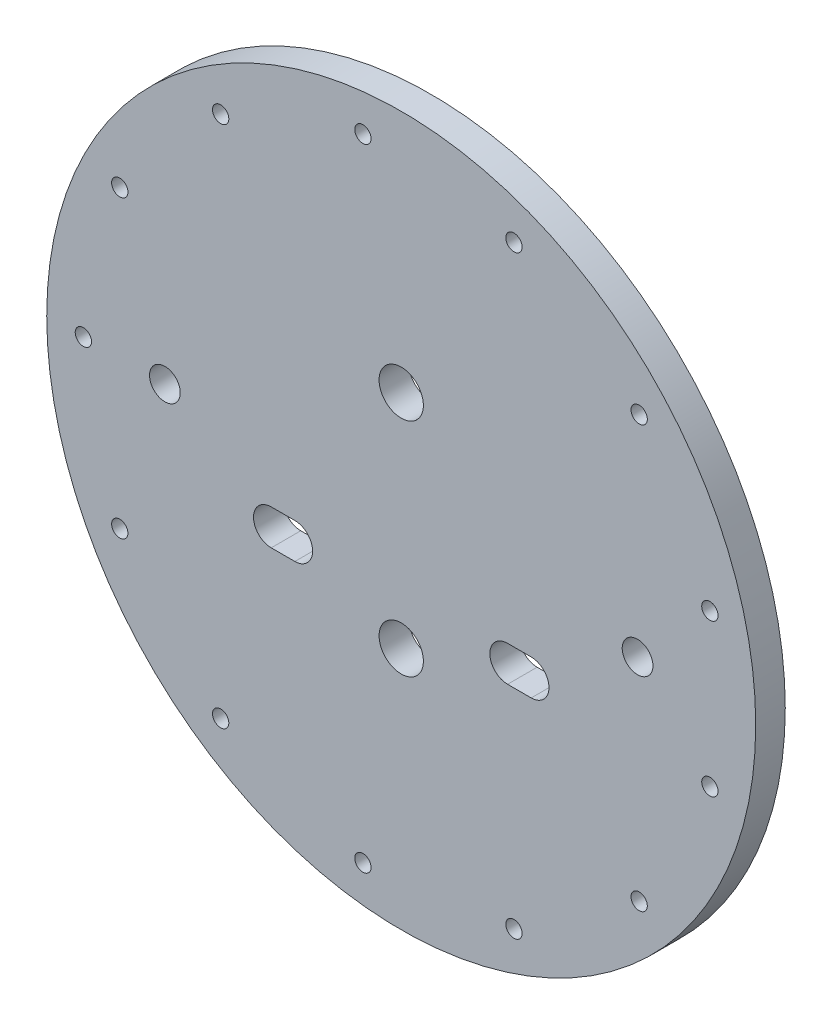
ISO-10303-21;
HEADER;
FILE_DESCRIPTION(('STEP AP214'),'2;1');
FILE_NAME('part.step','',(''),(''),'','','');
FILE_SCHEMA(('AUTOMOTIVE_DESIGN { 1 0 10303 214 1 1 1 1 }'));
ENDSEC;
DATA;
#1=APPLICATION_CONTEXT('core data for automotive mechanical design processes');
#2=APPLICATION_PROTOCOL_DEFINITION('international standard','automotive_design',2000,#1);
#3=PRODUCT_CONTEXT('',#1,'mechanical');
#4=PRODUCT('Part','Part','',(#3));
#5=PRODUCT_RELATED_PRODUCT_CATEGORY('part','',(#4));
#6=PRODUCT_DEFINITION_FORMATION('','',#4);
#7=PRODUCT_DEFINITION_CONTEXT('part definition',#1,'design');
#8=PRODUCT_DEFINITION('design','',#6,#7);
#9=PRODUCT_DEFINITION_SHAPE('','',#8);
#10=(LENGTH_UNIT() NAMED_UNIT(*) SI_UNIT(.MILLI.,.METRE.));
#11=(NAMED_UNIT(*) PLANE_ANGLE_UNIT() SI_UNIT($,.RADIAN.));
#12=(NAMED_UNIT(*) SI_UNIT($,.STERADIAN.) SOLID_ANGLE_UNIT());
#13=UNCERTAINTY_MEASURE_WITH_UNIT(LENGTH_MEASURE(1.E-05),#10,'distance_accuracy_value','');
#14=(GEOMETRIC_REPRESENTATION_CONTEXT(3) GLOBAL_UNCERTAINTY_ASSIGNED_CONTEXT((#13)) GLOBAL_UNIT_ASSIGNED_CONTEXT((#10,
#11,#12)) REPRESENTATION_CONTEXT('',''));
#15=CARTESIAN_POINT('',(0.,0.,0.));
#16=DIRECTION('',(0.,0.,1.));
#17=DIRECTION('',(1.,0.,0.));
#18=AXIS2_PLACEMENT_3D('',#15,#16,#17);
#19=CARTESIAN_POINT('',(0.,0.,3.175));
#20=DIRECTION('',(0.,0.,1.));
#21=DIRECTION('',(1.,0.,0.));
#22=AXIS2_PLACEMENT_3D('',#19,#20,#21);
#23=PLANE('',#22);
#24=CARTESIAN_POINT('',(-38.8135918851528,-56.23119562105,3.175));
#25=DIRECTION('',(0.,0.,1.));
#26=DIRECTION('',(0.568064746731154,0.822983865893658,0.));
#27=AXIS2_PLACEMENT_3D('',#24,#25,#26);
#28=CIRCLE('',#27,1.75259999999999);
#29=CARTESIAN_POINT('',(-37.8180016100318,-54.7888340976848,3.175));
#30=VERTEX_POINT('',#29);
#31=EDGE_CURVE('E546',#30,#30,#28,.T.);
#32=ORIENTED_EDGE('',*,*,#31,.F.);
#33=EDGE_LOOP('',(#32));
#34=FACE_BOUND('',#33,.T.);
#35=CARTESIAN_POINT('',(-8.23578921512499,-67.8278265316237,3.175));
#36=DIRECTION('',(0.,0.,1.));
#37=DIRECTION('',(0.12053668025532,0.992708874098054,0.));
#38=AXIS2_PLACEMENT_3D('',#35,#36,#37);
#39=CIRCLE('',#38,1.75259999999999);
#40=CARTESIAN_POINT('',(-8.02453662930952,-66.0880049588794,3.175));
#41=VERTEX_POINT('',#40);
#42=EDGE_CURVE('E547',#41,#41,#39,.T.);
#43=ORIENTED_EDGE('',*,*,#42,.F.);
#44=EDGE_LOOP('',(#43));
#45=FACE_BOUND('',#44,.T.);
#46=CARTESIAN_POINT('',(24.2287335120686,-63.8859197977235,3.175));
#47=DIRECTION('',(0.,0.,1.));
#48=DIRECTION('',(-0.35460488704254,0.935016242685413,0.));
#49=AXIS2_PLACEMENT_3D('',#46,#47,#48);
#50=CIRCLE('',#49,1.75259999999999);
#51=CARTESIAN_POINT('',(23.6072529870378,-62.2472103307931,3.175));
#52=VERTEX_POINT('',#51);
#53=EDGE_CURVE('E551',#52,#52,#50,.T.);
#54=ORIENTED_EDGE('',*,*,#53,.F.);
#55=EDGE_LOOP('',(#54));
#56=FACE_BOUND('',#55,.T.);
#57=CARTESIAN_POINT('',(51.1427453795389,-45.3085187469603,3.175));
#58=DIRECTION('',(0.,0.,1.));
#59=DIRECTION('',(-0.748510748171105,0.663122658240791,0.));
#60=AXIS2_PLACEMENT_3D('',#57,#58,#59);
#61=CIRCLE('',#60,1.75259999999999);
#62=CARTESIAN_POINT('',(49.8309054422942,-44.1463299761275,3.175));
#63=VERTEX_POINT('',#62);
#64=EDGE_CURVE('E559',#63,#63,#61,.T.);
#65=ORIENTED_EDGE('',*,*,#64,.F.);
#66=EDGE_LOOP('',(#65));
#67=FACE_BOUND('',#66,.T.);
#68=CARTESIAN_POINT('',(66.3405706174525,-16.3514820781112,3.175));
#69=DIRECTION('',(0.,0.,1.));
#70=DIRECTION('',(-0.970941817426054,0.239315664287552,0.));
#71=AXIS2_PLACEMENT_3D('',#68,#69,#70);
#72=CIRCLE('',#71,1.75259999999999);
#73=CARTESIAN_POINT('',(64.6388979882316,-15.9320574448809,3.175));
#74=VERTEX_POINT('',#73);
#75=EDGE_CURVE('E562',#74,#74,#72,.T.);
#76=ORIENTED_EDGE('',*,*,#75,.F.);
#77=EDGE_LOOP('',(#76));
#78=FACE_BOUND('',#77,.T.);
#79=CARTESIAN_POINT('',(66.3405706174523,16.3514820781122,3.175));
#80=DIRECTION('',(0.,0.,1.));
#81=DIRECTION('',(-0.97094181742605,-0.239315664287565,0.));
#82=AXIS2_PLACEMENT_3D('',#79,#80,#81);
#83=CIRCLE('',#82,1.75259999999999);
#84=CARTESIAN_POINT('',(64.6388979882314,15.9320574448818,3.175));
#85=VERTEX_POINT('',#84);
#86=EDGE_CURVE('E565',#85,#85,#83,.T.);
#87=ORIENTED_EDGE('',*,*,#86,.F.);
#88=EDGE_LOOP('',(#87));
#89=FACE_BOUND('',#88,.T.);
#90=CARTESIAN_POINT('',(51.1427453795383,45.308518746961,3.175));
#91=DIRECTION('',(0.,0.,1.));
#92=DIRECTION('',(-0.748510748171095,-0.663122658240802,0.));
#93=AXIS2_PLACEMENT_3D('',#90,#91,#92);
#94=CIRCLE('',#93,1.75259999999999);
#95=CARTESIAN_POINT('',(49.8309054422936,44.1463299761282,3.175));
#96=VERTEX_POINT('',#95);
#97=EDGE_CURVE('E568',#96,#96,#94,.T.);
#98=ORIENTED_EDGE('',*,*,#97,.F.);
#99=EDGE_LOOP('',(#98));
#100=FACE_BOUND('',#99,.T.);
#101=CARTESIAN_POINT('',(24.2287335120677,63.8859197977239,3.175));
#102=DIRECTION('',(0.,0.,1.));
#103=DIRECTION('',(-0.354604887042527,-0.935016242685418,0.));
#104=AXIS2_PLACEMENT_3D('',#101,#102,#103);
#105=CIRCLE('',#104,1.75259999999999);
#106=CARTESIAN_POINT('',(23.607252987037,62.2472103307934,3.175));
#107=VERTEX_POINT('',#106);
#108=EDGE_CURVE('E571',#107,#107,#105,.T.);
#109=ORIENTED_EDGE('',*,*,#108,.F.);
#110=EDGE_LOOP('',(#109));
#111=FACE_BOUND('',#110,.T.);
#112=CARTESIAN_POINT('',(-8.23578921512594,67.8278265316236,3.175));
#113=DIRECTION('',(0.,0.,1.));
#114=DIRECTION('',(0.120536680255334,-0.992708874098053,0.));
#115=AXIS2_PLACEMENT_3D('',#112,#113,#114);
#116=CIRCLE('',#115,1.75259999999999);
#117=CARTESIAN_POINT('',(-8.02453662931044,66.0880049588793,3.175));
#118=VERTEX_POINT('',#117);
#119=EDGE_CURVE('E573',#118,#118,#116,.T.);
#120=ORIENTED_EDGE('',*,*,#119,.F.);
#121=EDGE_LOOP('',(#120));
#122=FACE_BOUND('',#121,.T.);
#123=CARTESIAN_POINT('',(-38.8135918851536,56.2311956210495,3.175));
#124=DIRECTION('',(0.,0.,1.));
#125=DIRECTION('',(0.568064746731166,-0.822983865893649,0.));
#126=AXIS2_PLACEMENT_3D('',#123,#124,#125);
#127=CIRCLE('',#126,1.75259999999999);
#128=CARTESIAN_POINT('',(-37.8180016100326,54.7888340976843,3.175));
#129=VERTEX_POINT('',#128);
#130=EDGE_CURVE('E576',#129,#129,#127,.T.);
#131=ORIENTED_EDGE('',*,*,#130,.F.);
#132=EDGE_LOOP('',(#131));
#133=FACE_BOUND('',#132,.T.);
#134=CARTESIAN_POINT('',(-60.4996684087816,31.7526754530618,3.175));
#135=DIRECTION('',(0.,0.,1.));
#136=DIRECTION('',(0.885456025653216,-0.464723172043757,0.));
#137=AXIS2_PLACEMENT_3D('',#134,#135,#136);
#138=CIRCLE('',#137,1.75259999999999);
#139=CARTESIAN_POINT('',(-58.9478181782218,30.9382016217379,3.175));
#140=VERTEX_POINT('',#139);
#141=EDGE_CURVE('E554',#140,#140,#138,.T.);
#142=ORIENTED_EDGE('',*,*,#141,.F.);
#143=EDGE_LOOP('',(#142));
#144=FACE_BOUND('',#143,.T.);
#145=CARTESIAN_POINT('',(-60.4996684087812,-31.7526754530626,3.175));
#146=DIRECTION('',(0.,0.,1.));
#147=DIRECTION('',(0.885456025653209,0.46472317204377,0.));
#148=AXIS2_PLACEMENT_3D('',#145,#146,#147);
#149=CIRCLE('',#148,1.75259999999999);
#150=CARTESIAN_POINT('',(-58.9478181782214,-30.9382016217387,3.175));
#151=VERTEX_POINT('',#150);
#152=EDGE_CURVE('E203',#151,#151,#149,.T.);
#153=ORIENTED_EDGE('',*,*,#152,.F.);
#154=EDGE_LOOP('',(#153));
#155=FACE_BOUND('',#154,.T.);
#156=CARTESIAN_POINT('',(-68.326,0.,3.175));
#157=DIRECTION('',(0.,0.,1.));
#158=DIRECTION('',(1.,0.,0.));
#159=AXIS2_PLACEMENT_3D('',#156,#157,#158);
#160=CIRCLE('',#159,1.75259999999999);
#161=CARTESIAN_POINT('',(-66.5734,0.,3.175));
#162=VERTEX_POINT('',#161);
#163=EDGE_CURVE('E123',#162,#162,#160,.T.);
#164=ORIENTED_EDGE('',*,*,#163,.F.);
#165=EDGE_LOOP('',(#164));
#166=FACE_BOUND('',#165,.T.);
#167=CARTESIAN_POINT('',(27.94,-15.24,3.175));
#168=DIRECTION('',(0.,0.,-1.));
#169=DIRECTION('',(-1.,0.,0.));
#170=AXIS2_PLACEMENT_3D('',#167,#168,#169);
#171=CIRCLE('',#170,3.81);
#172=CARTESIAN_POINT('',(27.94,-11.43,3.175));
#173=VERTEX_POINT('',#172);
#174=CARTESIAN_POINT('',(27.94,-19.05,3.175));
#175=VERTEX_POINT('',#174);
#176=EDGE_CURVE('E140',#173,#175,#171,.T.);
#177=ORIENTED_EDGE('',*,*,#176,.T.);
#178=DIRECTION('',(-1.,0.,0.));
#179=VECTOR('',#178,1.);
#180=CARTESIAN_POINT('',(27.94,-19.05,3.175));
#181=LINE('',#180,#179);
#182=CARTESIAN_POINT('',(22.86,-19.05,3.175));
#183=VERTEX_POINT('',#182);
#184=EDGE_CURVE('E143',#175,#183,#181,.T.);
#185=ORIENTED_EDGE('',*,*,#184,.T.);
#186=CARTESIAN_POINT('',(22.86,-15.24,3.175));
#187=DIRECTION('',(0.,0.,-1.));
#188=DIRECTION('',(-1.,0.,0.));
#189=AXIS2_PLACEMENT_3D('',#186,#187,#188);
#190=CIRCLE('',#189,3.81);
#191=CARTESIAN_POINT('',(22.86,-11.43,3.175));
#192=VERTEX_POINT('',#191);
#193=EDGE_CURVE('E147',#183,#192,#190,.T.);
#194=ORIENTED_EDGE('',*,*,#193,.T.);
#195=DIRECTION('',(1.,0.,0.));
#196=VECTOR('',#195,1.);
#197=CARTESIAN_POINT('',(27.94,-11.43,3.175));
#198=LINE('',#197,#196);
#199=EDGE_CURVE('E150',#192,#173,#198,.T.);
#200=ORIENTED_EDGE('',*,*,#199,.T.);
#201=EDGE_LOOP('',(#177,#185,#194,#200));
#202=FACE_BOUND('',#201,.T.);
#203=CARTESIAN_POINT('',(0.,23.8125,3.175));
#204=DIRECTION('',(0.,0.,1.));
#205=DIRECTION('',(1.,0.,0.));
#206=AXIS2_PLACEMENT_3D('',#203,#204,#205);
#207=CIRCLE('',#206,4.76250000000001);
#208=CARTESIAN_POINT('',(4.76250000000001,23.8125,3.175));
#209=VERTEX_POINT('',#208);
#210=EDGE_CURVE('E178',#209,#209,#207,.T.);
#211=ORIENTED_EDGE('',*,*,#210,.F.);
#212=EDGE_LOOP('',(#211));
#213=FACE_BOUND('',#212,.T.);
#214=CARTESIAN_POINT('',(-50.8,0.,3.175));
#215=DIRECTION('',(0.,0.,1.));
#216=DIRECTION('',(1.,0.,0.));
#217=AXIS2_PLACEMENT_3D('',#214,#215,#216);
#218=CIRCLE('',#217,3.302);
#219=CARTESIAN_POINT('',(-47.498,0.,3.175));
#220=VERTEX_POINT('',#219);
#221=EDGE_CURVE('E190',#220,#220,#218,.T.);
#222=ORIENTED_EDGE('',*,*,#221,.F.);
#223=EDGE_LOOP('',(#222));
#224=FACE_BOUND('',#223,.T.);
#225=CARTESIAN_POINT('',(0.,0.,3.175));
#226=DIRECTION('',(0.,0.,1.));
#227=DIRECTION('',(1.,0.,0.));
#228=AXIS2_PLACEMENT_3D('',#225,#226,#227);
#229=CIRCLE('',#228,76.2);
#230=CARTESIAN_POINT('',(76.2,0.,3.175));
#231=VERTEX_POINT('',#230);
#232=EDGE_CURVE('E11',#231,#231,#229,.T.);
#233=ORIENTED_EDGE('',*,*,#232,.T.);
#234=EDGE_LOOP('',(#233));
#235=FACE_BOUND('',#234,.T.);
#236=CARTESIAN_POINT('',(50.8,0.,3.175));
#237=DIRECTION('',(0.,0.,1.));
#238=DIRECTION('',(1.,0.,0.));
#239=AXIS2_PLACEMENT_3D('',#236,#237,#238);
#240=CIRCLE('',#239,3.302);
#241=CARTESIAN_POINT('',(54.102,0.,3.175));
#242=VERTEX_POINT('',#241);
#243=EDGE_CURVE('E184',#242,#242,#240,.T.);
#244=ORIENTED_EDGE('',*,*,#243,.F.);
#245=EDGE_LOOP('',(#244));
#246=FACE_BOUND('',#245,.T.);
#247=CARTESIAN_POINT('',(0.,-23.8125,3.175));
#248=DIRECTION('',(0.,0.,1.));
#249=DIRECTION('',(1.,0.,0.));
#250=AXIS2_PLACEMENT_3D('',#247,#248,#249);
#251=CIRCLE('',#250,4.76250000000001);
#252=CARTESIAN_POINT('',(4.76250000000002,-23.8125,3.175));
#253=VERTEX_POINT('',#252);
#254=EDGE_CURVE('E172',#253,#253,#251,.T.);
#255=ORIENTED_EDGE('',*,*,#254,.F.);
#256=EDGE_LOOP('',(#255));
#257=FACE_BOUND('',#256,.T.);
#258=DIRECTION('',(1.,0.,0.));
#259=VECTOR('',#258,1.);
#260=CARTESIAN_POINT('',(-27.94,-19.05,3.175));
#261=LINE('',#260,#259);
#262=CARTESIAN_POINT('',(-27.94,-19.05,3.175));
#263=VERTEX_POINT('',#262);
#264=CARTESIAN_POINT('',(-22.86,-19.05,3.175));
#265=VERTEX_POINT('',#264);
#266=EDGE_CURVE('E114',#263,#265,#261,.T.);
#267=ORIENTED_EDGE('',*,*,#266,.F.);
#268=CARTESIAN_POINT('',(-27.94,-15.24,3.175));
#269=DIRECTION('',(0.,0.,1.));
#270=DIRECTION('',(1.,0.,0.));
#271=AXIS2_PLACEMENT_3D('',#268,#269,#270);
#272=CIRCLE('',#271,3.81);
#273=CARTESIAN_POINT('',(-27.94,-11.43,3.175));
#274=VERTEX_POINT('',#273);
#275=EDGE_CURVE('E110',#274,#263,#272,.T.);
#276=ORIENTED_EDGE('',*,*,#275,.F.);
#277=DIRECTION('',(-1.,0.,0.));
#278=VECTOR('',#277,1.);
#279=CARTESIAN_POINT('',(-27.94,-11.43,3.175));
#280=LINE('',#279,#278);
#281=CARTESIAN_POINT('',(-22.86,-11.43,3.175));
#282=VERTEX_POINT('',#281);
#283=EDGE_CURVE('E102',#282,#274,#280,.T.);
#284=ORIENTED_EDGE('',*,*,#283,.F.);
#285=CARTESIAN_POINT('',(-22.86,-15.24,3.175));
#286=DIRECTION('',(0.,0.,1.));
#287=DIRECTION('',(1.,0.,0.));
#288=AXIS2_PLACEMENT_3D('',#285,#286,#287);
#289=CIRCLE('',#288,3.81);
#290=EDGE_CURVE('E109',#265,#282,#289,.T.);
#291=ORIENTED_EDGE('',*,*,#290,.F.);
#292=EDGE_LOOP('',(#267,#276,#284,#291));
#293=FACE_BOUND('',#292,.T.);
#294=ADVANCED_FACE('F35',(#34,#45,#56,#67,#78,#89,#100,#111,#122,#133,#144,#155,#166,#202,#213,
#224,#235,#246,#257,#293),#23,.T.);
#295=CARTESIAN_POINT('',(0.,0.,-3.175));
#296=DIRECTION('',(0.,0.,1.));
#297=DIRECTION('',(1.,0.,0.));
#298=AXIS2_PLACEMENT_3D('',#295,#296,#297);
#299=PLANE('',#298);
#300=CARTESIAN_POINT('',(-38.8135918851528,-56.23119562105,-3.175));
#301=DIRECTION('',(0.,0.,1.));
#302=DIRECTION('',(1.,0.,0.));
#303=AXIS2_PLACEMENT_3D('',#300,#301,#302);
#304=CIRCLE('',#303,1.75259999999999);
#305=CARTESIAN_POINT('',(-37.0609918851528,-56.23119562105,-3.175));
#306=VERTEX_POINT('',#305);
#307=EDGE_CURVE('E39',#306,#306,#304,.T.);
#308=ORIENTED_EDGE('',*,*,#307,.T.);
#309=EDGE_LOOP('',(#308));
#310=FACE_BOUND('',#309,.T.);
#311=CARTESIAN_POINT('',(-8.23578921512499,-67.8278265316237,-3.175));
#312=DIRECTION('',(0.,0.,1.));
#313=DIRECTION('',(1.,0.,0.));
#314=AXIS2_PLACEMENT_3D('',#311,#312,#313);
#315=CIRCLE('',#314,1.75259999999999);
#316=CARTESIAN_POINT('',(-6.483189215125,-67.8278265316237,-3.175));
#317=VERTEX_POINT('',#316);
#318=EDGE_CURVE('E229',#317,#317,#315,.T.);
#319=ORIENTED_EDGE('',*,*,#318,.T.);
#320=EDGE_LOOP('',(#319));
#321=FACE_BOUND('',#320,.T.);
#322=CARTESIAN_POINT('',(24.2287335120686,-63.8859197977235,-3.175));
#323=DIRECTION('',(0.,0.,1.));
#324=DIRECTION('',(1.,0.,0.));
#325=AXIS2_PLACEMENT_3D('',#322,#323,#324);
#326=CIRCLE('',#325,1.75259999999999);
#327=CARTESIAN_POINT('',(25.9813335120685,-63.8859197977235,-3.175));
#328=VERTEX_POINT('',#327);
#329=EDGE_CURVE('E227',#328,#328,#326,.T.);
#330=ORIENTED_EDGE('',*,*,#329,.T.);
#331=EDGE_LOOP('',(#330));
#332=FACE_BOUND('',#331,.T.);
#333=CARTESIAN_POINT('',(51.1427453795389,-45.3085187469603,-3.175));
#334=DIRECTION('',(0.,0.,1.));
#335=DIRECTION('',(1.,0.,0.));
#336=AXIS2_PLACEMENT_3D('',#333,#334,#335);
#337=CIRCLE('',#336,1.75259999999999);
#338=CARTESIAN_POINT('',(52.8953453795389,-45.3085187469603,-3.175));
#339=VERTEX_POINT('',#338);
#340=EDGE_CURVE('E224',#339,#339,#337,.T.);
#341=ORIENTED_EDGE('',*,*,#340,.T.);
#342=EDGE_LOOP('',(#341));
#343=FACE_BOUND('',#342,.T.);
#344=CARTESIAN_POINT('',(66.3405706174525,-16.3514820781112,-3.175));
#345=DIRECTION('',(0.,0.,1.));
#346=DIRECTION('',(1.,0.,0.));
#347=AXIS2_PLACEMENT_3D('',#344,#345,#346);
#348=CIRCLE('',#347,1.75259999999999);
#349=CARTESIAN_POINT('',(68.0931706174525,-16.3514820781112,-3.175));
#350=VERTEX_POINT('',#349);
#351=EDGE_CURVE('E221',#350,#350,#348,.T.);
#352=ORIENTED_EDGE('',*,*,#351,.T.);
#353=EDGE_LOOP('',(#352));
#354=FACE_BOUND('',#353,.T.);
#355=CARTESIAN_POINT('',(66.3405706174523,16.3514820781122,-3.175));
#356=DIRECTION('',(0.,0.,1.));
#357=DIRECTION('',(1.,0.,0.));
#358=AXIS2_PLACEMENT_3D('',#355,#356,#357);
#359=CIRCLE('',#358,1.75259999999999);
#360=CARTESIAN_POINT('',(68.0931706174523,16.3514820781122,-3.175));
#361=VERTEX_POINT('',#360);
#362=EDGE_CURVE('E218',#361,#361,#359,.T.);
#363=ORIENTED_EDGE('',*,*,#362,.T.);
#364=EDGE_LOOP('',(#363));
#365=FACE_BOUND('',#364,.T.);
#366=CARTESIAN_POINT('',(51.1427453795383,45.308518746961,-3.175));
#367=DIRECTION('',(0.,0.,1.));
#368=DIRECTION('',(1.,0.,0.));
#369=AXIS2_PLACEMENT_3D('',#366,#367,#368);
#370=CIRCLE('',#369,1.75259999999999);
#371=CARTESIAN_POINT('',(52.8953453795383,45.308518746961,-3.175));
#372=VERTEX_POINT('',#371);
#373=EDGE_CURVE('E215',#372,#372,#370,.T.);
#374=ORIENTED_EDGE('',*,*,#373,.T.);
#375=EDGE_LOOP('',(#374));
#376=FACE_BOUND('',#375,.T.);
#377=CARTESIAN_POINT('',(24.2287335120677,63.8859197977239,-3.175));
#378=DIRECTION('',(0.,0.,1.));
#379=DIRECTION('',(1.,0.,0.));
#380=AXIS2_PLACEMENT_3D('',#377,#378,#379);
#381=CIRCLE('',#380,1.75259999999999);
#382=CARTESIAN_POINT('',(25.9813335120677,63.8859197977239,-3.175));
#383=VERTEX_POINT('',#382);
#384=EDGE_CURVE('E212',#383,#383,#381,.T.);
#385=ORIENTED_EDGE('',*,*,#384,.T.);
#386=EDGE_LOOP('',(#385));
#387=FACE_BOUND('',#386,.T.);
#388=CARTESIAN_POINT('',(-8.23578921512594,67.8278265316236,-3.175));
#389=DIRECTION('',(0.,0.,1.));
#390=DIRECTION('',(1.,0.,0.));
#391=AXIS2_PLACEMENT_3D('',#388,#389,#390);
#392=CIRCLE('',#391,1.75259999999999);
#393=CARTESIAN_POINT('',(-6.48318921512595,67.8278265316236,-3.175));
#394=VERTEX_POINT('',#393);
#395=EDGE_CURVE('E209',#394,#394,#392,.T.);
#396=ORIENTED_EDGE('',*,*,#395,.T.);
#397=EDGE_LOOP('',(#396));
#398=FACE_BOUND('',#397,.T.);
#399=CARTESIAN_POINT('',(-38.8135918851536,56.2311956210495,-3.175));
#400=DIRECTION('',(0.,0.,1.));
#401=DIRECTION('',(1.,0.,0.));
#402=AXIS2_PLACEMENT_3D('',#399,#400,#401);
#403=CIRCLE('',#402,1.75259999999999);
#404=CARTESIAN_POINT('',(-37.0609918851536,56.2311956210495,-3.175));
#405=VERTEX_POINT('',#404);
#406=EDGE_CURVE('E206',#405,#405,#403,.T.);
#407=ORIENTED_EDGE('',*,*,#406,.T.);
#408=EDGE_LOOP('',(#407));
#409=FACE_BOUND('',#408,.T.);
#410=CARTESIAN_POINT('',(-60.4996684087816,31.7526754530618,-3.175));
#411=DIRECTION('',(0.,0.,1.));
#412=DIRECTION('',(1.,0.,0.));
#413=AXIS2_PLACEMENT_3D('',#410,#411,#412);
#414=CIRCLE('',#413,1.75259999999999);
#415=CARTESIAN_POINT('',(-58.7470684087816,31.7526754530618,-3.175));
#416=VERTEX_POINT('',#415);
#417=EDGE_CURVE('E202',#416,#416,#414,.T.);
#418=ORIENTED_EDGE('',*,*,#417,.T.);
#419=EDGE_LOOP('',(#418));
#420=FACE_BOUND('',#419,.T.);
#421=CARTESIAN_POINT('',(-60.4996684087812,-31.7526754530626,-3.175));
#422=DIRECTION('',(0.,0.,1.));
#423=DIRECTION('',(1.,0.,0.));
#424=AXIS2_PLACEMENT_3D('',#421,#422,#423);
#425=CIRCLE('',#424,1.75259999999999);
#426=CARTESIAN_POINT('',(-58.7470684087812,-31.7526754530626,-3.175));
#427=VERTEX_POINT('',#426);
#428=EDGE_CURVE('E199',#427,#427,#425,.T.);
#429=ORIENTED_EDGE('',*,*,#428,.T.);
#430=EDGE_LOOP('',(#429));
#431=FACE_BOUND('',#430,.T.);
#432=CARTESIAN_POINT('',(-68.326,0.,-3.175));
#433=DIRECTION('',(0.,0.,1.));
#434=DIRECTION('',(1.,0.,0.));
#435=AXIS2_PLACEMENT_3D('',#432,#433,#434);
#436=CIRCLE('',#435,1.75259999999999);
#437=CARTESIAN_POINT('',(-66.5734,0.,-3.175));
#438=VERTEX_POINT('',#437);
#439=EDGE_CURVE('E130',#438,#438,#436,.T.);
#440=ORIENTED_EDGE('',*,*,#439,.T.);
#441=EDGE_LOOP('',(#440));
#442=FACE_BOUND('',#441,.T.);
#443=CARTESIAN_POINT('',(0.,-23.8125,-3.175));
#444=DIRECTION('',(0.,0.,1.));
#445=DIRECTION('',(1.,0.,0.));
#446=AXIS2_PLACEMENT_3D('',#443,#444,#445);
#447=CIRCLE('',#446,4.76250000000001);
#448=CARTESIAN_POINT('',(4.76250000000002,-23.8125,-3.175));
#449=VERTEX_POINT('',#448);
#450=EDGE_CURVE('E165',#449,#449,#447,.T.);
#451=ORIENTED_EDGE('',*,*,#450,.T.);
#452=EDGE_LOOP('',(#451));
#453=FACE_BOUND('',#452,.T.);
#454=CARTESIAN_POINT('',(0.,23.8125,-3.175));
#455=DIRECTION('',(0.,0.,1.));
#456=DIRECTION('',(1.,0.,0.));
#457=AXIS2_PLACEMENT_3D('',#454,#455,#456);
#458=CIRCLE('',#457,4.76250000000001);
#459=CARTESIAN_POINT('',(4.76250000000001,23.8125,-3.175));
#460=VERTEX_POINT('',#459);
#461=EDGE_CURVE('E175',#460,#460,#458,.T.);
#462=ORIENTED_EDGE('',*,*,#461,.T.);
#463=EDGE_LOOP('',(#462));
#464=FACE_BOUND('',#463,.T.);
#465=CARTESIAN_POINT('',(50.8,0.,-3.175));
#466=DIRECTION('',(0.,0.,1.));
#467=DIRECTION('',(1.,0.,0.));
#468=AXIS2_PLACEMENT_3D('',#465,#466,#467);
#469=CIRCLE('',#468,3.302);
#470=CARTESIAN_POINT('',(54.102,0.,-3.175));
#471=VERTEX_POINT('',#470);
#472=EDGE_CURVE('E181',#471,#471,#469,.T.);
#473=ORIENTED_EDGE('',*,*,#472,.T.);
#474=EDGE_LOOP('',(#473));
#475=FACE_BOUND('',#474,.T.);
#476=CARTESIAN_POINT('',(-50.8,0.,-3.175));
#477=DIRECTION('',(0.,0.,1.));
#478=DIRECTION('',(1.,0.,0.));
#479=AXIS2_PLACEMENT_3D('',#476,#477,#478);
#480=CIRCLE('',#479,3.302);
#481=CARTESIAN_POINT('',(-47.498,0.,-3.175));
#482=VERTEX_POINT('',#481);
#483=EDGE_CURVE('E187',#482,#482,#480,.T.);
#484=ORIENTED_EDGE('',*,*,#483,.T.);
#485=EDGE_LOOP('',(#484));
#486=FACE_BOUND('',#485,.T.);
#487=CARTESIAN_POINT('',(0.,0.,-3.175));
#488=DIRECTION('',(0.,0.,1.));
#489=DIRECTION('',(1.,0.,0.));
#490=AXIS2_PLACEMENT_3D('',#487,#488,#489);
#491=CIRCLE('',#490,76.2);
#492=CARTESIAN_POINT('',(76.2,0.,-3.175));
#493=VERTEX_POINT('',#492);
#494=EDGE_CURVE('E44',#493,#493,#491,.T.);
#495=ORIENTED_EDGE('',*,*,#494,.F.);
#496=EDGE_LOOP('',(#495));
#497=FACE_BOUND('',#496,.T.);
#498=DIRECTION('',(-1.,0.,0.));
#499=VECTOR('',#498,1.);
#500=CARTESIAN_POINT('',(27.94,-19.05,-3.175));
#501=LINE('',#500,#499);
#502=CARTESIAN_POINT('',(27.94,-19.05,-3.175));
#503=VERTEX_POINT('',#502);
#504=CARTESIAN_POINT('',(22.86,-19.05,-3.175));
#505=VERTEX_POINT('',#504);
#506=EDGE_CURVE('E155',#503,#505,#501,.T.);
#507=ORIENTED_EDGE('',*,*,#506,.F.);
#508=CARTESIAN_POINT('',(27.94,-15.24,-3.175));
#509=DIRECTION('',(0.,0.,-1.));
#510=DIRECTION('',(-1.,0.,0.));
#511=AXIS2_PLACEMENT_3D('',#508,#509,#510);
#512=CIRCLE('',#511,3.81);
#513=CARTESIAN_POINT('',(27.94,-11.43,-3.175));
#514=VERTEX_POINT('',#513);
#515=EDGE_CURVE('E136',#514,#503,#512,.T.);
#516=ORIENTED_EDGE('',*,*,#515,.F.);
#517=DIRECTION('',(1.,0.,0.));
#518=VECTOR('',#517,1.);
#519=CARTESIAN_POINT('',(27.94,-11.43,-3.175));
#520=LINE('',#519,#518);
#521=CARTESIAN_POINT('',(22.86,-11.43,-3.175));
#522=VERTEX_POINT('',#521);
#523=EDGE_CURVE('E144',#522,#514,#520,.T.);
#524=ORIENTED_EDGE('',*,*,#523,.F.);
#525=CARTESIAN_POINT('',(22.86,-15.24,-3.175));
#526=DIRECTION('',(0.,0.,-1.));
#527=DIRECTION('',(-1.,0.,0.));
#528=AXIS2_PLACEMENT_3D('',#525,#526,#527);
#529=CIRCLE('',#528,3.81);
#530=EDGE_CURVE('E158',#505,#522,#529,.T.);
#531=ORIENTED_EDGE('',*,*,#530,.F.);
#532=EDGE_LOOP('',(#507,#516,#524,#531));
#533=FACE_BOUND('',#532,.T.);
#534=CARTESIAN_POINT('',(-27.94,-15.24,-3.175));
#535=DIRECTION('',(0.,0.,1.));
#536=DIRECTION('',(1.,0.,0.));
#537=AXIS2_PLACEMENT_3D('',#534,#535,#536);
#538=CIRCLE('',#537,3.81);
#539=CARTESIAN_POINT('',(-27.94,-11.43,-3.175));
#540=VERTEX_POINT('',#539);
#541=CARTESIAN_POINT('',(-27.94,-19.05,-3.175));
#542=VERTEX_POINT('',#541);
#543=EDGE_CURVE('E60',#540,#542,#538,.T.);
#544=ORIENTED_EDGE('',*,*,#543,.T.);
#545=DIRECTION('',(1.,0.,0.));
#546=VECTOR('',#545,1.);
#547=CARTESIAN_POINT('',(-27.94,-19.05,-3.175));
#548=LINE('',#547,#546);
#549=CARTESIAN_POINT('',(-22.86,-19.05,-3.175));
#550=VERTEX_POINT('',#549);
#551=EDGE_CURVE('E117',#542,#550,#548,.T.);
#552=ORIENTED_EDGE('',*,*,#551,.T.);
#553=CARTESIAN_POINT('',(-22.86,-15.24,-3.175));
#554=DIRECTION('',(0.,0.,1.));
#555=DIRECTION('',(1.,0.,0.));
#556=AXIS2_PLACEMENT_3D('',#553,#554,#555);
#557=CIRCLE('',#556,3.81);
#558=CARTESIAN_POINT('',(-22.86,-11.43,-3.175));
#559=VERTEX_POINT('',#558);
#560=EDGE_CURVE('E120',#550,#559,#557,.T.);
#561=ORIENTED_EDGE('',*,*,#560,.T.);
#562=DIRECTION('',(-1.,0.,0.));
#563=VECTOR('',#562,1.);
#564=CARTESIAN_POINT('',(-27.94,-11.43,-3.175));
#565=LINE('',#564,#563);
#566=EDGE_CURVE('E129',#559,#540,#565,.T.);
#567=ORIENTED_EDGE('',*,*,#566,.T.);
#568=EDGE_LOOP('',(#544,#552,#561,#567));
#569=FACE_BOUND('',#568,.T.);
#570=ADVANCED_FACE('F244',(#310,#321,#332,#343,#354,#365,#376,#387,#398,#409,#420,#431,#442,
#453,#464,#475,#486,#497,#533,#569),#299,.F.);
#571=CARTESIAN_POINT('',(0.,0.,3.175));
#572=DIRECTION('',(0.,0.,-1.));
#573=DIRECTION('',(-1.,0.,0.));
#574=AXIS2_PLACEMENT_3D('',#571,#572,#573);
#575=CYLINDRICAL_SURFACE('',#574,76.2);
#576=ORIENTED_EDGE('',*,*,#232,.F.);
#577=EDGE_LOOP('',(#576));
#578=FACE_BOUND('',#577,.T.);
#579=ORIENTED_EDGE('',*,*,#494,.T.);
#580=EDGE_LOOP('',(#579));
#581=FACE_BOUND('',#580,.T.);
#582=ADVANCED_FACE('F37',(#578,#581),#575,.T.);
#583=CARTESIAN_POINT('',(-50.8,0.,3.175));
#584=DIRECTION('',(0.,0.,-1.));
#585=DIRECTION('',(-1.,0.,0.));
#586=AXIS2_PLACEMENT_3D('',#583,#584,#585);
#587=CYLINDRICAL_SURFACE('',#586,3.302);
#588=ORIENTED_EDGE('',*,*,#221,.T.);
#589=EDGE_LOOP('',(#588));
#590=FACE_BOUND('',#589,.T.);
#591=ORIENTED_EDGE('',*,*,#483,.F.);
#592=EDGE_LOOP('',(#591));
#593=FACE_BOUND('',#592,.T.);
#594=ADVANCED_FACE('F321',(#590,#593),#587,.F.);
#595=CARTESIAN_POINT('',(50.8,0.,3.175));
#596=DIRECTION('',(0.,0.,-1.));
#597=DIRECTION('',(-1.,0.,0.));
#598=AXIS2_PLACEMENT_3D('',#595,#596,#597);
#599=CYLINDRICAL_SURFACE('',#598,3.302);
#600=ORIENTED_EDGE('',*,*,#243,.T.);
#601=EDGE_LOOP('',(#600));
#602=FACE_BOUND('',#601,.T.);
#603=ORIENTED_EDGE('',*,*,#472,.F.);
#604=EDGE_LOOP('',(#603));
#605=FACE_BOUND('',#604,.T.);
#606=ADVANCED_FACE('F317',(#602,#605),#599,.F.);
#607=CARTESIAN_POINT('',(0.,23.8125,3.175));
#608=DIRECTION('',(0.,0.,-1.));
#609=DIRECTION('',(-1.,0.,0.));
#610=AXIS2_PLACEMENT_3D('',#607,#608,#609);
#611=CYLINDRICAL_SURFACE('',#610,4.76250000000001);
#612=ORIENTED_EDGE('',*,*,#210,.T.);
#613=EDGE_LOOP('',(#612));
#614=FACE_BOUND('',#613,.T.);
#615=ORIENTED_EDGE('',*,*,#461,.F.);
#616=EDGE_LOOP('',(#615));
#617=FACE_BOUND('',#616,.T.);
#618=ADVANCED_FACE('F263',(#614,#617),#611,.F.);
#619=CARTESIAN_POINT('',(0.,-23.8125,3.175));
#620=DIRECTION('',(0.,0.,-1.));
#621=DIRECTION('',(-1.,0.,0.));
#622=AXIS2_PLACEMENT_3D('',#619,#620,#621);
#623=CYLINDRICAL_SURFACE('',#622,4.76250000000001);
#624=ORIENTED_EDGE('',*,*,#254,.T.);
#625=EDGE_LOOP('',(#624));
#626=FACE_BOUND('',#625,.T.);
#627=ORIENTED_EDGE('',*,*,#450,.F.);
#628=EDGE_LOOP('',(#627));
#629=FACE_BOUND('',#628,.T.);
#630=ADVANCED_FACE('F259',(#626,#629),#623,.F.);
#631=CARTESIAN_POINT('',(27.94,-15.24,3.175));
#632=DIRECTION('',(0.,0.,-1.));
#633=DIRECTION('',(-1.,0.,0.));
#634=AXIS2_PLACEMENT_3D('',#631,#632,#633);
#635=CYLINDRICAL_SURFACE('',#634,3.81);
#636=ORIENTED_EDGE('',*,*,#515,.T.);
#637=DIRECTION('',(0.,0.,-1.));
#638=VECTOR('',#637,1.);
#639=CARTESIAN_POINT('',(27.94,-19.05,3.175));
#640=LINE('',#639,#638);
#641=EDGE_CURVE('E153',#175,#503,#640,.T.);
#642=ORIENTED_EDGE('',*,*,#641,.F.);
#643=ORIENTED_EDGE('',*,*,#176,.F.);
#644=DIRECTION('',(0.,0.,-1.));
#645=VECTOR('',#644,1.);
#646=CARTESIAN_POINT('',(27.94,-11.43,3.175));
#647=LINE('',#646,#645);
#648=EDGE_CURVE('E163',#173,#514,#647,.T.);
#649=ORIENTED_EDGE('',*,*,#648,.T.);
#650=EDGE_LOOP('',(#636,#642,#643,#649));
#651=FACE_BOUND('',#650,.T.);
#652=ADVANCED_FACE('F262',(#651),#635,.F.);
#653=CARTESIAN_POINT('',(27.94,-11.43,3.175));
#654=DIRECTION('',(0.,1.,0.));
#655=DIRECTION('',(0.,0.,1.));
#656=AXIS2_PLACEMENT_3D('',#653,#654,#655);
#657=PLANE('',#656);
#658=ORIENTED_EDGE('',*,*,#523,.T.);
#659=ORIENTED_EDGE('',*,*,#648,.F.);
#660=ORIENTED_EDGE('',*,*,#199,.F.);
#661=DIRECTION('',(0.,0.,-1.));
#662=VECTOR('',#661,1.);
#663=CARTESIAN_POINT('',(22.86,-11.43,3.175));
#664=LINE('',#663,#662);
#665=EDGE_CURVE('E166',#192,#522,#664,.T.);
#666=ORIENTED_EDGE('',*,*,#665,.T.);
#667=EDGE_LOOP('',(#658,#659,#660,#666));
#668=FACE_BOUND('',#667,.T.);
#669=ADVANCED_FACE('F301',(#668),#657,.F.);
#670=CARTESIAN_POINT('',(22.86,-15.24,3.175));
#671=DIRECTION('',(0.,0.,-1.));
#672=DIRECTION('',(-1.,0.,0.));
#673=AXIS2_PLACEMENT_3D('',#670,#671,#672);
#674=CYLINDRICAL_SURFACE('',#673,3.81);
#675=ORIENTED_EDGE('',*,*,#530,.T.);
#676=ORIENTED_EDGE('',*,*,#665,.F.);
#677=ORIENTED_EDGE('',*,*,#193,.F.);
#678=DIRECTION('',(0.,0.,-1.));
#679=VECTOR('',#678,1.);
#680=CARTESIAN_POINT('',(22.86,-19.05,3.175));
#681=LINE('',#680,#679);
#682=EDGE_CURVE('E168',#183,#505,#681,.T.);
#683=ORIENTED_EDGE('',*,*,#682,.T.);
#684=EDGE_LOOP('',(#675,#676,#677,#683));
#685=FACE_BOUND('',#684,.T.);
#686=ADVANCED_FACE('F304',(#685),#674,.F.);
#687=CARTESIAN_POINT('',(27.94,-19.05,3.175));
#688=DIRECTION('',(0.,-1.,0.));
#689=DIRECTION('',(0.,0.,-1.));
#690=AXIS2_PLACEMENT_3D('',#687,#688,#689);
#691=PLANE('',#690);
#692=ORIENTED_EDGE('',*,*,#506,.T.);
#693=ORIENTED_EDGE('',*,*,#682,.F.);
#694=ORIENTED_EDGE('',*,*,#184,.F.);
#695=ORIENTED_EDGE('',*,*,#641,.T.);
#696=EDGE_LOOP('',(#692,#693,#694,#695));
#697=FACE_BOUND('',#696,.T.);
#698=ADVANCED_FACE('F294',(#697),#691,.F.);
#699=CARTESIAN_POINT('',(-27.94,-15.24,3.175));
#700=DIRECTION('',(0.,0.,-1.));
#701=DIRECTION('',(-1.,0.,0.));
#702=AXIS2_PLACEMENT_3D('',#699,#700,#701);
#703=CYLINDRICAL_SURFACE('',#702,3.81);
#704=ORIENTED_EDGE('',*,*,#543,.F.);
#705=DIRECTION('',(0.,0.,-1.));
#706=VECTOR('',#705,1.);
#707=CARTESIAN_POINT('',(-27.94,-11.43,3.175));
#708=LINE('',#707,#706);
#709=EDGE_CURVE('E104',#274,#540,#708,.T.);
#710=ORIENTED_EDGE('',*,*,#709,.F.);
#711=ORIENTED_EDGE('',*,*,#275,.T.);
#712=DIRECTION('',(0.,0.,-1.));
#713=VECTOR('',#712,1.);
#714=CARTESIAN_POINT('',(-27.94,-19.05,3.175));
#715=LINE('',#714,#713);
#716=EDGE_CURVE('E134',#263,#542,#715,.T.);
#717=ORIENTED_EDGE('',*,*,#716,.T.);
#718=EDGE_LOOP('',(#704,#710,#711,#717));
#719=FACE_BOUND('',#718,.T.);
#720=ADVANCED_FACE('F112',(#719),#703,.F.);
#721=CARTESIAN_POINT('',(-27.94,-19.05,3.175));
#722=DIRECTION('',(0.,1.,0.));
#723=DIRECTION('',(0.,0.,1.));
#724=AXIS2_PLACEMENT_3D('',#721,#722,#723);
#725=PLANE('',#724);
#726=ORIENTED_EDGE('',*,*,#551,.F.);
#727=ORIENTED_EDGE('',*,*,#716,.F.);
#728=ORIENTED_EDGE('',*,*,#266,.T.);
#729=DIRECTION('',(0.,0.,-1.));
#730=VECTOR('',#729,1.);
#731=CARTESIAN_POINT('',(-22.86,-19.05,3.175));
#732=LINE('',#731,#730);
#733=EDGE_CURVE('E137',#265,#550,#732,.T.);
#734=ORIENTED_EDGE('',*,*,#733,.T.);
#735=EDGE_LOOP('',(#726,#727,#728,#734));
#736=FACE_BOUND('',#735,.T.);
#737=ADVANCED_FACE('F286',(#736),#725,.T.);
#738=CARTESIAN_POINT('',(-22.86,-15.24,3.175));
#739=DIRECTION('',(0.,0.,-1.));
#740=DIRECTION('',(-1.,0.,0.));
#741=AXIS2_PLACEMENT_3D('',#738,#739,#740);
#742=CYLINDRICAL_SURFACE('',#741,3.81);
#743=ORIENTED_EDGE('',*,*,#560,.F.);
#744=ORIENTED_EDGE('',*,*,#733,.F.);
#745=ORIENTED_EDGE('',*,*,#290,.T.);
#746=DIRECTION('',(0.,0.,-1.));
#747=VECTOR('',#746,1.);
#748=CARTESIAN_POINT('',(-22.86,-11.43,3.175));
#749=LINE('',#748,#747);
#750=EDGE_CURVE('E52',#282,#559,#749,.T.);
#751=ORIENTED_EDGE('',*,*,#750,.T.);
#752=EDGE_LOOP('',(#743,#744,#745,#751));
#753=FACE_BOUND('',#752,.T.);
#754=ADVANCED_FACE('F284',(#753),#742,.F.);
#755=CARTESIAN_POINT('',(-27.94,-11.43,3.175));
#756=DIRECTION('',(0.,-1.,0.));
#757=DIRECTION('',(0.,0.,-1.));
#758=AXIS2_PLACEMENT_3D('',#755,#756,#757);
#759=PLANE('',#758);
#760=ORIENTED_EDGE('',*,*,#566,.F.);
#761=ORIENTED_EDGE('',*,*,#750,.F.);
#762=ORIENTED_EDGE('',*,*,#283,.T.);
#763=ORIENTED_EDGE('',*,*,#709,.T.);
#764=EDGE_LOOP('',(#760,#761,#762,#763));
#765=FACE_BOUND('',#764,.T.);
#766=ADVANCED_FACE('F103',(#765),#759,.T.);
#767=CARTESIAN_POINT('',(-68.326,0.,-14.859));
#768=DIRECTION('',(0.,0.,1.));
#769=DIRECTION('',(1.,0.,0.));
#770=AXIS2_PLACEMENT_3D('',#767,#768,#769);
#771=CYLINDRICAL_SURFACE('',#770,1.75259999999999);
#772=ORIENTED_EDGE('',*,*,#163,.T.);
#773=EDGE_LOOP('',(#772));
#774=FACE_BOUND('',#773,.T.);
#775=ORIENTED_EDGE('',*,*,#439,.F.);
#776=EDGE_LOOP('',(#775));
#777=FACE_BOUND('',#776,.T.);
#778=ADVANCED_FACE('F239',(#774,#777),#771,.F.);
#779=CARTESIAN_POINT('',(-60.4996684087812,-31.7526754530626,-14.859));
#780=DIRECTION('',(0.,0.,1.));
#781=DIRECTION('',(1.,0.,0.));
#782=AXIS2_PLACEMENT_3D('',#779,#780,#781);
#783=CYLINDRICAL_SURFACE('',#782,1.75259999999999);
#784=ORIENTED_EDGE('',*,*,#152,.T.);
#785=EDGE_LOOP('',(#784));
#786=FACE_BOUND('',#785,.T.);
#787=ORIENTED_EDGE('',*,*,#428,.F.);
#788=EDGE_LOOP('',(#787));
#789=FACE_BOUND('',#788,.T.);
#790=ADVANCED_FACE('F352',(#786,#789),#783,.F.);
#791=CARTESIAN_POINT('',(-60.4996684087816,31.7526754530618,-14.859));
#792=DIRECTION('',(0.,0.,1.));
#793=DIRECTION('',(1.,0.,0.));
#794=AXIS2_PLACEMENT_3D('',#791,#792,#793);
#795=CYLINDRICAL_SURFACE('',#794,1.75259999999999);
#796=ORIENTED_EDGE('',*,*,#141,.T.);
#797=EDGE_LOOP('',(#796));
#798=FACE_BOUND('',#797,.T.);
#799=ORIENTED_EDGE('',*,*,#417,.F.);
#800=EDGE_LOOP('',(#799));
#801=FACE_BOUND('',#800,.T.);
#802=ADVANCED_FACE('F430',(#798,#801),#795,.F.);
#803=CARTESIAN_POINT('',(-38.8135918851536,56.2311956210495,-14.859));
#804=DIRECTION('',(0.,0.,1.));
#805=DIRECTION('',(1.,0.,0.));
#806=AXIS2_PLACEMENT_3D('',#803,#804,#805);
#807=CYLINDRICAL_SURFACE('',#806,1.75259999999999);
#808=ORIENTED_EDGE('',*,*,#130,.T.);
#809=EDGE_LOOP('',(#808));
#810=FACE_BOUND('',#809,.T.);
#811=ORIENTED_EDGE('',*,*,#406,.F.);
#812=EDGE_LOOP('',(#811));
#813=FACE_BOUND('',#812,.T.);
#814=ADVANCED_FACE('F436',(#810,#813),#807,.F.);
#815=CARTESIAN_POINT('',(-8.23578921512594,67.8278265316236,-14.859));
#816=DIRECTION('',(0.,0.,1.));
#817=DIRECTION('',(1.,0.,0.));
#818=AXIS2_PLACEMENT_3D('',#815,#816,#817);
#819=CYLINDRICAL_SURFACE('',#818,1.75259999999999);
#820=ORIENTED_EDGE('',*,*,#119,.T.);
#821=EDGE_LOOP('',(#820));
#822=FACE_BOUND('',#821,.T.);
#823=ORIENTED_EDGE('',*,*,#395,.F.);
#824=EDGE_LOOP('',(#823));
#825=FACE_BOUND('',#824,.T.);
#826=ADVANCED_FACE('F444',(#822,#825),#819,.F.);
#827=CARTESIAN_POINT('',(24.2287335120677,63.8859197977239,-14.859));
#828=DIRECTION('',(0.,0.,1.));
#829=DIRECTION('',(1.,0.,0.));
#830=AXIS2_PLACEMENT_3D('',#827,#828,#829);
#831=CYLINDRICAL_SURFACE('',#830,1.75259999999999);
#832=ORIENTED_EDGE('',*,*,#108,.T.);
#833=EDGE_LOOP('',(#832));
#834=FACE_BOUND('',#833,.T.);
#835=ORIENTED_EDGE('',*,*,#384,.F.);
#836=EDGE_LOOP('',(#835));
#837=FACE_BOUND('',#836,.T.);
#838=ADVANCED_FACE('F452',(#834,#837),#831,.F.);
#839=CARTESIAN_POINT('',(51.1427453795383,45.308518746961,-14.859));
#840=DIRECTION('',(0.,0.,1.));
#841=DIRECTION('',(1.,0.,0.));
#842=AXIS2_PLACEMENT_3D('',#839,#840,#841);
#843=CYLINDRICAL_SURFACE('',#842,1.75259999999999);
#844=ORIENTED_EDGE('',*,*,#97,.T.);
#845=EDGE_LOOP('',(#844));
#846=FACE_BOUND('',#845,.T.);
#847=ORIENTED_EDGE('',*,*,#373,.F.);
#848=EDGE_LOOP('',(#847));
#849=FACE_BOUND('',#848,.T.);
#850=ADVANCED_FACE('F460',(#846,#849),#843,.F.);
#851=CARTESIAN_POINT('',(66.3405706174523,16.3514820781122,-14.859));
#852=DIRECTION('',(0.,0.,1.));
#853=DIRECTION('',(1.,0.,0.));
#854=AXIS2_PLACEMENT_3D('',#851,#852,#853);
#855=CYLINDRICAL_SURFACE('',#854,1.75259999999999);
#856=ORIENTED_EDGE('',*,*,#86,.T.);
#857=EDGE_LOOP('',(#856));
#858=FACE_BOUND('',#857,.T.);
#859=ORIENTED_EDGE('',*,*,#362,.F.);
#860=EDGE_LOOP('',(#859));
#861=FACE_BOUND('',#860,.T.);
#862=ADVANCED_FACE('F468',(#858,#861),#855,.F.);
#863=CARTESIAN_POINT('',(66.3405706174525,-16.3514820781112,-14.859));
#864=DIRECTION('',(0.,0.,1.));
#865=DIRECTION('',(1.,0.,0.));
#866=AXIS2_PLACEMENT_3D('',#863,#864,#865);
#867=CYLINDRICAL_SURFACE('',#866,1.75259999999999);
#868=ORIENTED_EDGE('',*,*,#75,.T.);
#869=EDGE_LOOP('',(#868));
#870=FACE_BOUND('',#869,.T.);
#871=ORIENTED_EDGE('',*,*,#351,.F.);
#872=EDGE_LOOP('',(#871));
#873=FACE_BOUND('',#872,.T.);
#874=ADVANCED_FACE('F476',(#870,#873),#867,.F.);
#875=CARTESIAN_POINT('',(51.1427453795389,-45.3085187469603,-14.859));
#876=DIRECTION('',(0.,0.,1.));
#877=DIRECTION('',(1.,0.,0.));
#878=AXIS2_PLACEMENT_3D('',#875,#876,#877);
#879=CYLINDRICAL_SURFACE('',#878,1.75259999999999);
#880=ORIENTED_EDGE('',*,*,#64,.T.);
#881=EDGE_LOOP('',(#880));
#882=FACE_BOUND('',#881,.T.);
#883=ORIENTED_EDGE('',*,*,#340,.F.);
#884=EDGE_LOOP('',(#883));
#885=FACE_BOUND('',#884,.T.);
#886=ADVANCED_FACE('F484',(#882,#885),#879,.F.);
#887=CARTESIAN_POINT('',(24.2287335120686,-63.8859197977235,-14.859));
#888=DIRECTION('',(0.,0.,1.));
#889=DIRECTION('',(1.,0.,0.));
#890=AXIS2_PLACEMENT_3D('',#887,#888,#889);
#891=CYLINDRICAL_SURFACE('',#890,1.75259999999999);
#892=ORIENTED_EDGE('',*,*,#53,.T.);
#893=EDGE_LOOP('',(#892));
#894=FACE_BOUND('',#893,.T.);
#895=ORIENTED_EDGE('',*,*,#329,.F.);
#896=EDGE_LOOP('',(#895));
#897=FACE_BOUND('',#896,.T.);
#898=ADVANCED_FACE('F492',(#894,#897),#891,.F.);
#899=CARTESIAN_POINT('',(-8.23578921512499,-67.8278265316237,-14.859));
#900=DIRECTION('',(0.,0.,1.));
#901=DIRECTION('',(1.,0.,0.));
#902=AXIS2_PLACEMENT_3D('',#899,#900,#901);
#903=CYLINDRICAL_SURFACE('',#902,1.75259999999999);
#904=ORIENTED_EDGE('',*,*,#42,.T.);
#905=EDGE_LOOP('',(#904));
#906=FACE_BOUND('',#905,.T.);
#907=ORIENTED_EDGE('',*,*,#318,.F.);
#908=EDGE_LOOP('',(#907));
#909=FACE_BOUND('',#908,.T.);
#910=ADVANCED_FACE('F500',(#906,#909),#903,.F.);
#911=CARTESIAN_POINT('',(-38.8135918851528,-56.23119562105,-14.859));
#912=DIRECTION('',(0.,0.,1.));
#913=DIRECTION('',(1.,0.,0.));
#914=AXIS2_PLACEMENT_3D('',#911,#912,#913);
#915=CYLINDRICAL_SURFACE('',#914,1.75259999999999);
#916=ORIENTED_EDGE('',*,*,#31,.T.);
#917=EDGE_LOOP('',(#916));
#918=FACE_BOUND('',#917,.T.);
#919=ORIENTED_EDGE('',*,*,#307,.F.);
#920=EDGE_LOOP('',(#919));
#921=FACE_BOUND('',#920,.T.);
#922=ADVANCED_FACE('F508',(#918,#921),#915,.F.);
#923=CLOSED_SHELL('',(#294,#570,#582,#594,#606,#618,#630,#652,#669,#686,#698,#720,#737,#754,
#766,#778,#790,#802,#814,#826,#838,#850,#862,#874,#886,#898,#910,#922));
#924=MANIFOLD_SOLID_BREP('B2',#923);
#925=ADVANCED_BREP_SHAPE_REPRESENTATION('',(#18,#924),#14);
#926=SHAPE_DEFINITION_REPRESENTATION(#9,#925);
ENDSEC;
END-ISO-10303-21;
